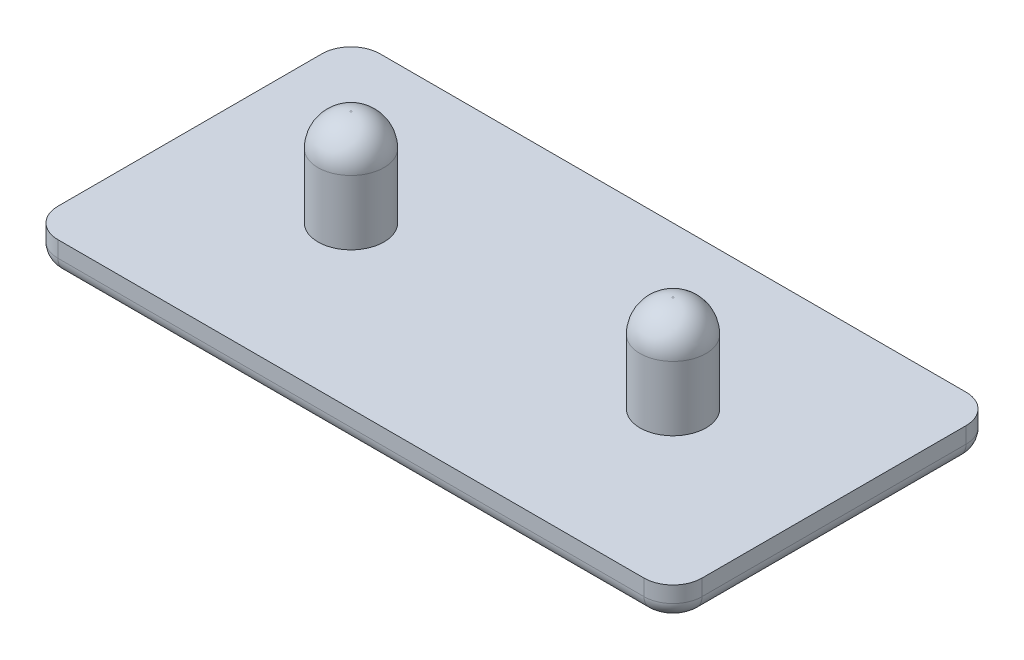
ISO-10303-21;
HEADER;
FILE_DESCRIPTION(('STEP AP214'),'2;1');
FILE_NAME('part.step','',(''),(''),'','','');
FILE_SCHEMA(('AUTOMOTIVE_DESIGN { 1 0 10303 214 1 1 1 1 }'));
ENDSEC;
DATA;
#1=APPLICATION_CONTEXT('core data for automotive mechanical design processes');
#2=APPLICATION_PROTOCOL_DEFINITION('international standard','automotive_design',2000,#1);
#3=PRODUCT_CONTEXT('',#1,'mechanical');
#4=PRODUCT('Part','Part','',(#3));
#5=PRODUCT_RELATED_PRODUCT_CATEGORY('part','',(#4));
#6=PRODUCT_DEFINITION_FORMATION('','',#4);
#7=PRODUCT_DEFINITION_CONTEXT('part definition',#1,'design');
#8=PRODUCT_DEFINITION('design','',#6,#7);
#9=PRODUCT_DEFINITION_SHAPE('','',#8);
#10=(LENGTH_UNIT() NAMED_UNIT(*) SI_UNIT(.MILLI.,.METRE.));
#11=(NAMED_UNIT(*) PLANE_ANGLE_UNIT() SI_UNIT($,.RADIAN.));
#12=(NAMED_UNIT(*) SI_UNIT($,.STERADIAN.) SOLID_ANGLE_UNIT());
#13=UNCERTAINTY_MEASURE_WITH_UNIT(LENGTH_MEASURE(1.E-05),#10,'distance_accuracy_value','');
#14=(GEOMETRIC_REPRESENTATION_CONTEXT(3) GLOBAL_UNCERTAINTY_ASSIGNED_CONTEXT((#13)) GLOBAL_UNIT_ASSIGNED_CONTEXT((#10,
#11,#12)) REPRESENTATION_CONTEXT('',''));
#15=CARTESIAN_POINT('',(0.,0.,0.));
#16=DIRECTION('',(0.,0.,1.));
#17=DIRECTION('',(1.,0.,0.));
#18=AXIS2_PLACEMENT_3D('',#15,#16,#17);
#19=CARTESIAN_POINT('',(1.8,2.,-1.8));
#20=DIRECTION('',(0.,1.,0.));
#21=DIRECTION('',(0.,0.,1.));
#22=AXIS2_PLACEMENT_3D('',#19,#20,#21);
#23=PLANE('',#22);
#24=CARTESIAN_POINT('',(10.,2.,-10.));
#25=DIRECTION('',(0.,1.,0.));
#26=DIRECTION('',(0.,0.,1.));
#27=AXIS2_PLACEMENT_3D('',#24,#25,#26);
#28=CIRCLE('',#27,2.05);
#29=CARTESIAN_POINT('',(10.,2.,-7.95));
#30=VERTEX_POINT('',#29);
#31=EDGE_CURVE('E153',#30,#30,#28,.T.);
#32=ORIENTED_EDGE('',*,*,#31,.F.);
#33=EDGE_LOOP('',(#32));
#34=FACE_BOUND('',#33,.T.);
#35=CARTESIAN_POINT('',(1.8,2.,-1.8));
#36=DIRECTION('',(0.,1.,0.));
#37=DIRECTION('',(0.,0.,1.));
#38=AXIS2_PLACEMENT_3D('',#35,#36,#37);
#39=CIRCLE('',#38,1.8);
#40=CARTESIAN_POINT('',(0.,2.,-1.8));
#41=VERTEX_POINT('',#40);
#42=CARTESIAN_POINT('',(1.8,2.,0.));
#43=VERTEX_POINT('',#42);
#44=EDGE_CURVE('E145',#41,#43,#39,.T.);
#45=ORIENTED_EDGE('',*,*,#44,.T.);
#46=DIRECTION('',(1.,0.,0.));
#47=VECTOR('',#46,1.);
#48=CARTESIAN_POINT('',(1.8,2.,0.));
#49=LINE('',#48,#47);
#50=CARTESIAN_POINT('',(38.2,2.,0.));
#51=VERTEX_POINT('',#50);
#52=EDGE_CURVE('E132',#43,#51,#49,.T.);
#53=ORIENTED_EDGE('',*,*,#52,.T.);
#54=CARTESIAN_POINT('',(38.2,2.,-1.8));
#55=DIRECTION('',(0.,1.,0.));
#56=DIRECTION('',(0.,0.,1.));
#57=AXIS2_PLACEMENT_3D('',#54,#55,#56);
#58=CIRCLE('',#57,1.8);
#59=CARTESIAN_POINT('',(40.,2.,-1.8));
#60=VERTEX_POINT('',#59);
#61=EDGE_CURVE('E144',#51,#60,#58,.T.);
#62=ORIENTED_EDGE('',*,*,#61,.T.);
#63=DIRECTION('',(0.,0.,-1.));
#64=VECTOR('',#63,1.);
#65=CARTESIAN_POINT('',(40.,2.,-1.8));
#66=LINE('',#65,#64);
#67=CARTESIAN_POINT('',(40.,2.,-18.2));
#68=VERTEX_POINT('',#67);
#69=EDGE_CURVE('E269',#60,#68,#66,.T.);
#70=ORIENTED_EDGE('',*,*,#69,.T.);
#71=CARTESIAN_POINT('',(38.2,2.,-18.2));
#72=DIRECTION('',(0.,1.,0.));
#73=DIRECTION('',(0.,0.,1.));
#74=AXIS2_PLACEMENT_3D('',#71,#72,#73);
#75=CIRCLE('',#74,1.8);
#76=CARTESIAN_POINT('',(38.2,2.,-20.));
#77=VERTEX_POINT('',#76);
#78=EDGE_CURVE('E272',#68,#77,#75,.T.);
#79=ORIENTED_EDGE('',*,*,#78,.T.);
#80=DIRECTION('',(-1.,0.,0.));
#81=VECTOR('',#80,1.);
#82=CARTESIAN_POINT('',(1.8,2.,-20.));
#83=LINE('',#82,#81);
#84=CARTESIAN_POINT('',(1.8,2.,-20.));
#85=VERTEX_POINT('',#84);
#86=EDGE_CURVE('E275',#77,#85,#83,.T.);
#87=ORIENTED_EDGE('',*,*,#86,.T.);
#88=CARTESIAN_POINT('',(1.8,2.,-18.2));
#89=DIRECTION('',(0.,1.,0.));
#90=DIRECTION('',(0.,0.,1.));
#91=AXIS2_PLACEMENT_3D('',#88,#89,#90);
#92=CIRCLE('',#91,1.8);
#93=CARTESIAN_POINT('',(0.,2.,-18.2));
#94=VERTEX_POINT('',#93);
#95=EDGE_CURVE('E278',#85,#94,#92,.T.);
#96=ORIENTED_EDGE('',*,*,#95,.T.);
#97=DIRECTION('',(0.,0.,1.));
#98=VECTOR('',#97,1.);
#99=CARTESIAN_POINT('',(0.,2.,-1.8));
#100=LINE('',#99,#98);
#101=EDGE_CURVE('E150',#94,#41,#100,.T.);
#102=ORIENTED_EDGE('',*,*,#101,.T.);
#103=EDGE_LOOP('',(#45,#53,#62,#70,#79,#87,#96,#102));
#104=FACE_BOUND('',#103,.T.);
#105=CARTESIAN_POINT('',(30.,2.,-10.));
#106=DIRECTION('',(0.,1.,0.));
#107=DIRECTION('',(0.,0.,1.));
#108=AXIS2_PLACEMENT_3D('',#105,#106,#107);
#109=CIRCLE('',#108,2.04999999999999);
#110=CARTESIAN_POINT('',(30.,2.,-7.95000000000001));
#111=VERTEX_POINT('',#110);
#112=EDGE_CURVE('E254',#111,#111,#109,.T.);
#113=ORIENTED_EDGE('',*,*,#112,.F.);
#114=EDGE_LOOP('',(#113));
#115=FACE_BOUND('',#114,.T.);
#116=ADVANCED_FACE('F39',(#34,#104,#115),#23,.T.);
#117=CARTESIAN_POINT('',(1.8,0.,-1.8));
#118=DIRECTION('',(0.,1.,0.));
#119=DIRECTION('',(0.,0.,1.));
#120=AXIS2_PLACEMENT_3D('',#117,#118,#119);
#121=PLANE('',#120);
#122=CARTESIAN_POINT('',(38.2,0.,-1.8));
#123=DIRECTION('',(0.,1.,0.));
#124=DIRECTION('',(0.,0.,1.));
#125=AXIS2_PLACEMENT_3D('',#122,#123,#124);
#126=CIRCLE('',#125,0.800000000000001);
#127=CARTESIAN_POINT('',(39.,0.,-1.8));
#128=VERTEX_POINT('',#127);
#129=CARTESIAN_POINT('',(38.2,0.,-0.999999999999999));
#130=VERTEX_POINT('',#129);
#131=EDGE_CURVE('E201',#128,#130,#126,.F.);
#132=ORIENTED_EDGE('',*,*,#131,.T.);
#133=DIRECTION('',(1.,0.,0.));
#134=VECTOR('',#133,1.);
#135=CARTESIAN_POINT('',(1.8,0.,-1.));
#136=LINE('',#135,#134);
#137=CARTESIAN_POINT('',(1.8,0.,-1.));
#138=VERTEX_POINT('',#137);
#139=EDGE_CURVE('E204',#130,#138,#136,.F.);
#140=ORIENTED_EDGE('',*,*,#139,.T.);
#141=CARTESIAN_POINT('',(1.8,0.,-1.8));
#142=DIRECTION('',(0.,1.,0.));
#143=DIRECTION('',(0.,0.,1.));
#144=AXIS2_PLACEMENT_3D('',#141,#142,#143);
#145=CIRCLE('',#144,0.8);
#146=CARTESIAN_POINT('',(1.,0.,-1.8));
#147=VERTEX_POINT('',#146);
#148=EDGE_CURVE('E183',#138,#147,#145,.F.);
#149=ORIENTED_EDGE('',*,*,#148,.T.);
#150=DIRECTION('',(0.,0.,1.));
#151=VECTOR('',#150,1.);
#152=CARTESIAN_POINT('',(1.,0.,-1.8));
#153=LINE('',#152,#151);
#154=CARTESIAN_POINT('',(1.,0.,-18.2));
#155=VERTEX_POINT('',#154);
#156=EDGE_CURVE('E186',#147,#155,#153,.F.);
#157=ORIENTED_EDGE('',*,*,#156,.T.);
#158=CARTESIAN_POINT('',(1.8,0.,-18.2));
#159=DIRECTION('',(0.,1.,0.));
#160=DIRECTION('',(0.,0.,1.));
#161=AXIS2_PLACEMENT_3D('',#158,#159,#160);
#162=CIRCLE('',#161,0.8);
#163=CARTESIAN_POINT('',(1.8,0.,-19.));
#164=VERTEX_POINT('',#163);
#165=EDGE_CURVE('E189',#155,#164,#162,.F.);
#166=ORIENTED_EDGE('',*,*,#165,.T.);
#167=DIRECTION('',(-1.,0.,0.));
#168=VECTOR('',#167,1.);
#169=CARTESIAN_POINT('',(1.8,0.,-19.));
#170=LINE('',#169,#168);
#171=CARTESIAN_POINT('',(38.2,0.,-19.));
#172=VERTEX_POINT('',#171);
#173=EDGE_CURVE('E192',#164,#172,#170,.F.);
#174=ORIENTED_EDGE('',*,*,#173,.T.);
#175=CARTESIAN_POINT('',(38.2,0.,-18.2));
#176=DIRECTION('',(0.,1.,0.));
#177=DIRECTION('',(0.,0.,1.));
#178=AXIS2_PLACEMENT_3D('',#175,#176,#177);
#179=CIRCLE('',#178,0.800000000000001);
#180=CARTESIAN_POINT('',(39.,0.,-18.2));
#181=VERTEX_POINT('',#180);
#182=EDGE_CURVE('E195',#172,#181,#179,.F.);
#183=ORIENTED_EDGE('',*,*,#182,.T.);
#184=DIRECTION('',(0.,0.,-1.));
#185=VECTOR('',#184,1.);
#186=CARTESIAN_POINT('',(39.,0.,-1.8));
#187=LINE('',#186,#185);
#188=EDGE_CURVE('E198',#181,#128,#187,.F.);
#189=ORIENTED_EDGE('',*,*,#188,.T.);
#190=EDGE_LOOP('',(#132,#140,#149,#157,#166,#174,#183,#189));
#191=FACE_BOUND('',#190,.T.);
#192=ADVANCED_FACE('F320',(#191),#121,.F.);
#193=CARTESIAN_POINT('',(1.8,2.,-1.8));
#194=DIRECTION('',(0.,-1.,0.));
#195=DIRECTION('',(0.,0.,-1.));
#196=AXIS2_PLACEMENT_3D('',#193,#194,#195);
#197=CYLINDRICAL_SURFACE('',#196,1.8);
#198=DIRECTION('',(0.,-1.,0.));
#199=VECTOR('',#198,1.);
#200=CARTESIAN_POINT('',(0.,2.,-1.8));
#201=LINE('',#200,#199);
#202=CARTESIAN_POINT('',(0.,1.,-1.8));
#203=VERTEX_POINT('',#202);
#204=EDGE_CURVE('E283',#41,#203,#201,.T.);
#205=ORIENTED_EDGE('',*,*,#204,.T.);
#206=CARTESIAN_POINT('',(1.8,1.,-1.8));
#207=DIRECTION('',(0.,1.,0.));
#208=DIRECTION('',(0.,0.,1.));
#209=AXIS2_PLACEMENT_3D('',#206,#207,#208);
#210=CIRCLE('',#209,1.8);
#211=CARTESIAN_POINT('',(1.8,1.,0.));
#212=VERTEX_POINT('',#211);
#213=EDGE_CURVE('E11',#203,#212,#210,.T.);
#214=ORIENTED_EDGE('',*,*,#213,.T.);
#215=DIRECTION('',(0.,-1.,0.));
#216=VECTOR('',#215,1.);
#217=CARTESIAN_POINT('',(1.8,2.,0.));
#218=LINE('',#217,#216);
#219=EDGE_CURVE('E137',#43,#212,#218,.T.);
#220=ORIENTED_EDGE('',*,*,#219,.F.);
#221=ORIENTED_EDGE('',*,*,#44,.F.);
#222=EDGE_LOOP('',(#205,#214,#220,#221));
#223=FACE_BOUND('',#222,.T.);
#224=ADVANCED_FACE('F155',(#223),#197,.T.);
#225=CARTESIAN_POINT('',(1.8,2.,0.));
#226=DIRECTION('',(0.,0.,-1.));
#227=DIRECTION('',(-1.,0.,0.));
#228=AXIS2_PLACEMENT_3D('',#225,#226,#227);
#229=PLANE('',#228);
#230=ORIENTED_EDGE('',*,*,#219,.T.);
#231=DIRECTION('',(1.,0.,0.));
#232=VECTOR('',#231,1.);
#233=CARTESIAN_POINT('',(1.8,1.,0.));
#234=LINE('',#233,#232);
#235=CARTESIAN_POINT('',(38.2,1.,0.));
#236=VERTEX_POINT('',#235);
#237=EDGE_CURVE('E180',#212,#236,#234,.T.);
#238=ORIENTED_EDGE('',*,*,#237,.T.);
#239=DIRECTION('',(0.,-1.,0.));
#240=VECTOR('',#239,1.);
#241=CARTESIAN_POINT('',(38.2,2.,0.));
#242=LINE('',#241,#240);
#243=EDGE_CURVE('E140',#51,#236,#242,.T.);
#244=ORIENTED_EDGE('',*,*,#243,.F.);
#245=ORIENTED_EDGE('',*,*,#52,.F.);
#246=EDGE_LOOP('',(#230,#238,#244,#245));
#247=FACE_BOUND('',#246,.T.);
#248=ADVANCED_FACE('F134',(#247),#229,.F.);
#249=CARTESIAN_POINT('',(38.2,2.,-1.8));
#250=DIRECTION('',(0.,-1.,0.));
#251=DIRECTION('',(0.,0.,-1.));
#252=AXIS2_PLACEMENT_3D('',#249,#250,#251);
#253=CYLINDRICAL_SURFACE('',#252,1.8);
#254=ORIENTED_EDGE('',*,*,#243,.T.);
#255=CARTESIAN_POINT('',(38.2,1.,-1.8));
#256=DIRECTION('',(0.,1.,0.));
#257=DIRECTION('',(0.,0.,1.));
#258=AXIS2_PLACEMENT_3D('',#255,#256,#257);
#259=CIRCLE('',#258,1.8);
#260=CARTESIAN_POINT('',(40.,1.,-1.8));
#261=VERTEX_POINT('',#260);
#262=EDGE_CURVE('E208',#236,#261,#259,.T.);
#263=ORIENTED_EDGE('',*,*,#262,.T.);
#264=DIRECTION('',(0.,-1.,0.));
#265=VECTOR('',#264,1.);
#266=CARTESIAN_POINT('',(40.,2.,-1.8));
#267=LINE('',#266,#265);
#268=EDGE_CURVE('E165',#60,#261,#267,.T.);
#269=ORIENTED_EDGE('',*,*,#268,.F.);
#270=ORIENTED_EDGE('',*,*,#61,.F.);
#271=EDGE_LOOP('',(#254,#263,#269,#270));
#272=FACE_BOUND('',#271,.T.);
#273=ADVANCED_FACE('F346',(#272),#253,.T.);
#274=CARTESIAN_POINT('',(40.,2.,-1.8));
#275=DIRECTION('',(-1.,0.,0.));
#276=DIRECTION('',(0.,0.,1.));
#277=AXIS2_PLACEMENT_3D('',#274,#275,#276);
#278=PLANE('',#277);
#279=ORIENTED_EDGE('',*,*,#268,.T.);
#280=DIRECTION('',(0.,0.,-1.));
#281=VECTOR('',#280,1.);
#282=CARTESIAN_POINT('',(40.,1.,-1.8));
#283=LINE('',#282,#281);
#284=CARTESIAN_POINT('',(40.,1.,-18.2));
#285=VERTEX_POINT('',#284);
#286=EDGE_CURVE('E211',#261,#285,#283,.T.);
#287=ORIENTED_EDGE('',*,*,#286,.T.);
#288=DIRECTION('',(0.,-1.,0.));
#289=VECTOR('',#288,1.);
#290=CARTESIAN_POINT('',(40.,2.,-18.2));
#291=LINE('',#290,#289);
#292=EDGE_CURVE('E296',#68,#285,#291,.T.);
#293=ORIENTED_EDGE('',*,*,#292,.F.);
#294=ORIENTED_EDGE('',*,*,#69,.F.);
#295=EDGE_LOOP('',(#279,#287,#293,#294));
#296=FACE_BOUND('',#295,.T.);
#297=ADVANCED_FACE('F305',(#296),#278,.F.);
#298=CARTESIAN_POINT('',(38.2,2.,-18.2));
#299=DIRECTION('',(0.,-1.,0.));
#300=DIRECTION('',(0.,0.,-1.));
#301=AXIS2_PLACEMENT_3D('',#298,#299,#300);
#302=CYLINDRICAL_SURFACE('',#301,1.8);
#303=ORIENTED_EDGE('',*,*,#292,.T.);
#304=CARTESIAN_POINT('',(38.2,1.,-18.2));
#305=DIRECTION('',(0.,1.,0.));
#306=DIRECTION('',(0.,0.,1.));
#307=AXIS2_PLACEMENT_3D('',#304,#305,#306);
#308=CIRCLE('',#307,1.8);
#309=CARTESIAN_POINT('',(38.2,1.,-20.));
#310=VERTEX_POINT('',#309);
#311=EDGE_CURVE('E214',#285,#310,#308,.T.);
#312=ORIENTED_EDGE('',*,*,#311,.T.);
#313=DIRECTION('',(0.,-1.,0.));
#314=VECTOR('',#313,1.);
#315=CARTESIAN_POINT('',(38.2,2.,-20.));
#316=LINE('',#315,#314);
#317=EDGE_CURVE('E292',#77,#310,#316,.T.);
#318=ORIENTED_EDGE('',*,*,#317,.F.);
#319=ORIENTED_EDGE('',*,*,#78,.F.);
#320=EDGE_LOOP('',(#303,#312,#318,#319));
#321=FACE_BOUND('',#320,.T.);
#322=ADVANCED_FACE('F339',(#321),#302,.T.);
#323=CARTESIAN_POINT('',(1.8,2.,-20.));
#324=DIRECTION('',(0.,0.,1.));
#325=DIRECTION('',(1.,0.,0.));
#326=AXIS2_PLACEMENT_3D('',#323,#324,#325);
#327=PLANE('',#326);
#328=ORIENTED_EDGE('',*,*,#317,.T.);
#329=DIRECTION('',(-1.,0.,0.));
#330=VECTOR('',#329,1.);
#331=CARTESIAN_POINT('',(1.8,1.,-20.));
#332=LINE('',#331,#330);
#333=CARTESIAN_POINT('',(1.8,1.,-20.));
#334=VERTEX_POINT('',#333);
#335=EDGE_CURVE('E217',#310,#334,#332,.T.);
#336=ORIENTED_EDGE('',*,*,#335,.T.);
#337=DIRECTION('',(0.,-1.,0.));
#338=VECTOR('',#337,1.);
#339=CARTESIAN_POINT('',(1.8,2.,-20.));
#340=LINE('',#339,#338);
#341=EDGE_CURVE('E289',#85,#334,#340,.T.);
#342=ORIENTED_EDGE('',*,*,#341,.F.);
#343=ORIENTED_EDGE('',*,*,#86,.F.);
#344=EDGE_LOOP('',(#328,#336,#342,#343));
#345=FACE_BOUND('',#344,.T.);
#346=ADVANCED_FACE('F343',(#345),#327,.F.);
#347=CARTESIAN_POINT('',(1.8,2.,-18.2));
#348=DIRECTION('',(0.,-1.,0.));
#349=DIRECTION('',(0.,0.,-1.));
#350=AXIS2_PLACEMENT_3D('',#347,#348,#349);
#351=CYLINDRICAL_SURFACE('',#350,1.8);
#352=ORIENTED_EDGE('',*,*,#341,.T.);
#353=CARTESIAN_POINT('',(1.8,1.,-18.2));
#354=DIRECTION('',(0.,1.,0.));
#355=DIRECTION('',(0.,0.,1.));
#356=AXIS2_PLACEMENT_3D('',#353,#354,#355);
#357=CIRCLE('',#356,1.8);
#358=CARTESIAN_POINT('',(0.,1.,-18.2));
#359=VERTEX_POINT('',#358);
#360=EDGE_CURVE('E64',#334,#359,#357,.T.);
#361=ORIENTED_EDGE('',*,*,#360,.T.);
#362=DIRECTION('',(0.,-1.,0.));
#363=VECTOR('',#362,1.);
#364=CARTESIAN_POINT('',(0.,2.,-18.2));
#365=LINE('',#364,#363);
#366=EDGE_CURVE('E286',#94,#359,#365,.T.);
#367=ORIENTED_EDGE('',*,*,#366,.F.);
#368=ORIENTED_EDGE('',*,*,#95,.F.);
#369=EDGE_LOOP('',(#352,#361,#367,#368));
#370=FACE_BOUND('',#369,.T.);
#371=ADVANCED_FACE('F370',(#370),#351,.T.);
#372=CARTESIAN_POINT('',(0.,2.,-1.8));
#373=DIRECTION('',(1.,0.,0.));
#374=DIRECTION('',(0.,0.,-1.));
#375=AXIS2_PLACEMENT_3D('',#372,#373,#374);
#376=PLANE('',#375);
#377=ORIENTED_EDGE('',*,*,#366,.T.);
#378=DIRECTION('',(0.,0.,1.));
#379=VECTOR('',#378,1.);
#380=CARTESIAN_POINT('',(0.,1.,-1.8));
#381=LINE('',#380,#379);
#382=EDGE_CURVE('E49',#359,#203,#381,.T.);
#383=ORIENTED_EDGE('',*,*,#382,.T.);
#384=ORIENTED_EDGE('',*,*,#204,.F.);
#385=ORIENTED_EDGE('',*,*,#101,.F.);
#386=EDGE_LOOP('',(#377,#383,#384,#385));
#387=FACE_BOUND('',#386,.T.);
#388=ADVANCED_FACE('F367',(#387),#376,.F.);
#389=CARTESIAN_POINT('',(30.,8.,-10.));
#390=DIRECTION('',(0.,-1.,0.));
#391=DIRECTION('',(0.,0.,-1.));
#392=AXIS2_PLACEMENT_3D('',#389,#390,#391);
#393=CYLINDRICAL_SURFACE('',#392,2.04999999999999);
#394=CARTESIAN_POINT('',(30.,6.,-10.));
#395=DIRECTION('',(0.,1.,0.));
#396=DIRECTION('',(0.,0.,1.));
#397=AXIS2_PLACEMENT_3D('',#394,#395,#396);
#398=CIRCLE('',#397,2.04999999999999);
#399=CARTESIAN_POINT('',(30.,6.,-7.95000000000001));
#400=VERTEX_POINT('',#399);
#401=EDGE_CURVE('E176',#400,#400,#398,.F.);
#402=ORIENTED_EDGE('',*,*,#401,.T.);
#403=EDGE_LOOP('',(#402));
#404=FACE_BOUND('',#403,.T.);
#405=ORIENTED_EDGE('',*,*,#112,.T.);
#406=EDGE_LOOP('',(#405));
#407=FACE_BOUND('',#406,.T.);
#408=ADVANCED_FACE('F364',(#404,#407),#393,.T.);
#409=CARTESIAN_POINT('',(0.,8.,0.));
#410=DIRECTION('',(0.,1.,0.));
#411=DIRECTION('',(0.,0.,1.));
#412=AXIS2_PLACEMENT_3D('',#409,#410,#411);
#413=PLANE('',#412);
#414=CARTESIAN_POINT('',(30.,8.,-10.));
#415=DIRECTION('',(0.,1.,0.));
#416=DIRECTION('',(0.,0.,1.));
#417=AXIS2_PLACEMENT_3D('',#414,#415,#416);
#418=CIRCLE('',#417,0.0499999999999932);
#419=CARTESIAN_POINT('',(30.,8.,-9.95000000000001));
#420=VERTEX_POINT('',#419);
#421=EDGE_CURVE('E172',#420,#420,#418,.T.);
#422=ORIENTED_EDGE('',*,*,#421,.T.);
#423=EDGE_LOOP('',(#422));
#424=FACE_BOUND('',#423,.T.);
#425=ADVANCED_FACE('F399',(#424),#413,.T.);
#426=CARTESIAN_POINT('',(10.,8.,-10.));
#427=DIRECTION('',(0.,-1.,0.));
#428=DIRECTION('',(0.,0.,-1.));
#429=AXIS2_PLACEMENT_3D('',#426,#427,#428);
#430=CYLINDRICAL_SURFACE('',#429,2.05);
#431=CARTESIAN_POINT('',(10.,6.,-10.));
#432=DIRECTION('',(0.,1.,0.));
#433=DIRECTION('',(0.,0.,1.));
#434=AXIS2_PLACEMENT_3D('',#431,#432,#433);
#435=CIRCLE('',#434,2.05);
#436=CARTESIAN_POINT('',(10.,6.,-7.95));
#437=VERTEX_POINT('',#436);
#438=EDGE_CURVE('E163',#437,#437,#435,.F.);
#439=ORIENTED_EDGE('',*,*,#438,.T.);
#440=EDGE_LOOP('',(#439));
#441=FACE_BOUND('',#440,.T.);
#442=ORIENTED_EDGE('',*,*,#31,.T.);
#443=EDGE_LOOP('',(#442));
#444=FACE_BOUND('',#443,.T.);
#445=ADVANCED_FACE('F406',(#441,#444),#430,.T.);
#446=CARTESIAN_POINT('',(0.,8.,0.));
#447=DIRECTION('',(0.,1.,0.));
#448=DIRECTION('',(0.,0.,1.));
#449=AXIS2_PLACEMENT_3D('',#446,#447,#448);
#450=PLANE('',#449);
#451=CARTESIAN_POINT('',(10.,8.,-10.));
#452=DIRECTION('',(0.,1.,0.));
#453=DIRECTION('',(0.,0.,1.));
#454=AXIS2_PLACEMENT_3D('',#451,#452,#453);
#455=CIRCLE('',#454,0.0500000000000001);
#456=CARTESIAN_POINT('',(10.,8.,-9.95));
#457=VERTEX_POINT('',#456);
#458=EDGE_CURVE('E158',#457,#457,#455,.T.);
#459=ORIENTED_EDGE('',*,*,#458,.T.);
#460=EDGE_LOOP('',(#459));
#461=FACE_BOUND('',#460,.T.);
#462=ADVANCED_FACE('F413',(#461),#450,.T.);
#463=CARTESIAN_POINT('',(10.,6.,-10.));
#464=DIRECTION('',(0.,1.,0.));
#465=DIRECTION('',(0.,0.,1.));
#466=AXIS2_PLACEMENT_3D('',#463,#464,#465);
#467=DEGENERATE_TOROIDAL_SURFACE('',#466,0.0500000000000001,2.,.T.);
#468=ORIENTED_EDGE('',*,*,#438,.F.);
#469=EDGE_LOOP('',(#468));
#470=FACE_BOUND('',#469,.T.);
#471=ORIENTED_EDGE('',*,*,#458,.F.);
#472=EDGE_LOOP('',(#471));
#473=FACE_BOUND('',#472,.T.);
#474=ADVANCED_FACE('F421',(#470,#473),#467,.T.);
#475=CARTESIAN_POINT('',(30.,6.,-10.));
#476=DIRECTION('',(0.,1.,0.));
#477=DIRECTION('',(0.,0.,1.));
#478=AXIS2_PLACEMENT_3D('',#475,#476,#477);
#479=DEGENERATE_TOROIDAL_SURFACE('',#478,0.0499999999999932,2.,.T.);
#480=ORIENTED_EDGE('',*,*,#401,.F.);
#481=EDGE_LOOP('',(#480));
#482=FACE_BOUND('',#481,.T.);
#483=ORIENTED_EDGE('',*,*,#421,.F.);
#484=EDGE_LOOP('',(#483));
#485=FACE_BOUND('',#484,.T.);
#486=ADVANCED_FACE('F429',(#482,#485),#479,.T.);
#487=CARTESIAN_POINT('',(1.8,1.,-19.));
#488=DIRECTION('',(-1.,0.,0.));
#489=DIRECTION('',(0.,0.,1.));
#490=AXIS2_PLACEMENT_3D('',#487,#488,#489);
#491=CYLINDRICAL_SURFACE('',#490,1.);
#492=CARTESIAN_POINT('',(38.2,1.,-19.));
#493=DIRECTION('',(1.,0.,0.));
#494=DIRECTION('',(0.,0.,-1.));
#495=AXIS2_PLACEMENT_3D('',#492,#493,#494);
#496=CIRCLE('',#495,1.);
#497=EDGE_CURVE('E245',#172,#310,#496,.T.);
#498=ORIENTED_EDGE('',*,*,#497,.F.);
#499=ORIENTED_EDGE('',*,*,#173,.F.);
#500=CARTESIAN_POINT('',(1.8,1.,-19.));
#501=DIRECTION('',(-1.,0.,0.));
#502=DIRECTION('',(0.,0.,1.));
#503=AXIS2_PLACEMENT_3D('',#500,#501,#502);
#504=CIRCLE('',#503,1.);
#505=EDGE_CURVE('E43',#334,#164,#504,.T.);
#506=ORIENTED_EDGE('',*,*,#505,.F.);
#507=ORIENTED_EDGE('',*,*,#335,.F.);
#508=EDGE_LOOP('',(#498,#499,#506,#507));
#509=FACE_BOUND('',#508,.T.);
#510=ADVANCED_FACE('F41',(#509),#491,.T.);
#511=CARTESIAN_POINT('',(1.8,1.,-18.2));
#512=DIRECTION('',(0.,1.,0.));
#513=DIRECTION('',(0.,0.,1.));
#514=AXIS2_PLACEMENT_3D('',#511,#512,#513);
#515=DEGENERATE_TOROIDAL_SURFACE('',#514,0.8,1.,.T.);
#516=ORIENTED_EDGE('',*,*,#505,.T.);
#517=ORIENTED_EDGE('',*,*,#165,.F.);
#518=CARTESIAN_POINT('',(1.,1.,-18.2));
#519=DIRECTION('',(0.,0.,1.));
#520=DIRECTION('',(1.,0.,0.));
#521=AXIS2_PLACEMENT_3D('',#518,#519,#520);
#522=CIRCLE('',#521,1.);
#523=EDGE_CURVE('E242',#359,#155,#522,.T.);
#524=ORIENTED_EDGE('',*,*,#523,.F.);
#525=ORIENTED_EDGE('',*,*,#360,.F.);
#526=EDGE_LOOP('',(#516,#517,#524,#525));
#527=FACE_BOUND('',#526,.T.);
#528=ADVANCED_FACE('F332',(#527),#515,.T.);
#529=CARTESIAN_POINT('',(38.2,1.,-18.2));
#530=DIRECTION('',(0.,1.,0.));
#531=DIRECTION('',(0.,0.,1.));
#532=AXIS2_PLACEMENT_3D('',#529,#530,#531);
#533=DEGENERATE_TOROIDAL_SURFACE('',#532,0.800000000000001,1.,.T.);
#534=ORIENTED_EDGE('',*,*,#497,.T.);
#535=ORIENTED_EDGE('',*,*,#311,.F.);
#536=CARTESIAN_POINT('',(39.,1.,-18.2));
#537=DIRECTION('',(0.,0.,1.));
#538=DIRECTION('',(1.,0.,0.));
#539=AXIS2_PLACEMENT_3D('',#536,#537,#538);
#540=CIRCLE('',#539,1.);
#541=EDGE_CURVE('E238',#181,#285,#540,.T.);
#542=ORIENTED_EDGE('',*,*,#541,.F.);
#543=ORIENTED_EDGE('',*,*,#182,.F.);
#544=EDGE_LOOP('',(#534,#535,#542,#543));
#545=FACE_BOUND('',#544,.T.);
#546=ADVANCED_FACE('F336',(#545),#533,.T.);
#547=CARTESIAN_POINT('',(1.,1.,-1.8));
#548=DIRECTION('',(0.,0.,1.));
#549=DIRECTION('',(1.,0.,0.));
#550=AXIS2_PLACEMENT_3D('',#547,#548,#549);
#551=CYLINDRICAL_SURFACE('',#550,1.);
#552=ORIENTED_EDGE('',*,*,#523,.T.);
#553=ORIENTED_EDGE('',*,*,#156,.F.);
#554=CARTESIAN_POINT('',(1.,1.,-1.8));
#555=DIRECTION('',(0.,0.,1.));
#556=DIRECTION('',(1.,0.,0.));
#557=AXIS2_PLACEMENT_3D('',#554,#555,#556);
#558=CIRCLE('',#557,1.);
#559=EDGE_CURVE('E234',#203,#147,#558,.T.);
#560=ORIENTED_EDGE('',*,*,#559,.F.);
#561=ORIENTED_EDGE('',*,*,#382,.F.);
#562=EDGE_LOOP('',(#552,#553,#560,#561));
#563=FACE_BOUND('',#562,.T.);
#564=ADVANCED_FACE('F330',(#563),#551,.T.);
#565=CARTESIAN_POINT('',(39.,1.,-1.8));
#566=DIRECTION('',(0.,0.,-1.));
#567=DIRECTION('',(-1.,0.,0.));
#568=AXIS2_PLACEMENT_3D('',#565,#566,#567);
#569=CYLINDRICAL_SURFACE('',#568,1.);
#570=ORIENTED_EDGE('',*,*,#541,.T.);
#571=ORIENTED_EDGE('',*,*,#286,.F.);
#572=CARTESIAN_POINT('',(39.,1.,-1.8));
#573=DIRECTION('',(0.,0.,1.));
#574=DIRECTION('',(1.,0.,0.));
#575=AXIS2_PLACEMENT_3D('',#572,#573,#574);
#576=CIRCLE('',#575,1.);
#577=EDGE_CURVE('E230',#128,#261,#576,.T.);
#578=ORIENTED_EDGE('',*,*,#577,.F.);
#579=ORIENTED_EDGE('',*,*,#188,.F.);
#580=EDGE_LOOP('',(#570,#571,#578,#579));
#581=FACE_BOUND('',#580,.T.);
#582=ADVANCED_FACE('F310',(#581),#569,.T.);
#583=CARTESIAN_POINT('',(1.8,1.,-1.8));
#584=DIRECTION('',(0.,1.,0.));
#585=DIRECTION('',(0.,0.,1.));
#586=AXIS2_PLACEMENT_3D('',#583,#584,#585);
#587=DEGENERATE_TOROIDAL_SURFACE('',#586,0.8,1.,.T.);
#588=ORIENTED_EDGE('',*,*,#559,.T.);
#589=ORIENTED_EDGE('',*,*,#148,.F.);
#590=CARTESIAN_POINT('',(1.8,1.,-1.));
#591=DIRECTION('',(1.,0.,0.));
#592=DIRECTION('',(0.,0.,-1.));
#593=AXIS2_PLACEMENT_3D('',#590,#591,#592);
#594=CIRCLE('',#593,1.);
#595=EDGE_CURVE('E227',#212,#138,#594,.T.);
#596=ORIENTED_EDGE('',*,*,#595,.F.);
#597=ORIENTED_EDGE('',*,*,#213,.F.);
#598=EDGE_LOOP('',(#588,#589,#596,#597));
#599=FACE_BOUND('',#598,.T.);
#600=ADVANCED_FACE('F326',(#599),#587,.T.);
#601=CARTESIAN_POINT('',(38.2,1.,-1.8));
#602=DIRECTION('',(0.,1.,0.));
#603=DIRECTION('',(0.,0.,1.));
#604=AXIS2_PLACEMENT_3D('',#601,#602,#603);
#605=DEGENERATE_TOROIDAL_SURFACE('',#604,0.800000000000001,1.,.T.);
#606=ORIENTED_EDGE('',*,*,#577,.T.);
#607=ORIENTED_EDGE('',*,*,#262,.F.);
#608=CARTESIAN_POINT('',(38.2,1.,-0.999999999999999));
#609=DIRECTION('',(-1.,0.,0.));
#610=DIRECTION('',(0.,0.,1.));
#611=AXIS2_PLACEMENT_3D('',#608,#609,#610);
#612=CIRCLE('',#611,1.);
#613=EDGE_CURVE('E224',#130,#236,#612,.T.);
#614=ORIENTED_EDGE('',*,*,#613,.F.);
#615=ORIENTED_EDGE('',*,*,#131,.F.);
#616=EDGE_LOOP('',(#606,#607,#614,#615));
#617=FACE_BOUND('',#616,.T.);
#618=ADVANCED_FACE('F316',(#617),#605,.T.);
#619=CARTESIAN_POINT('',(1.8,1.,-1.));
#620=DIRECTION('',(1.,0.,0.));
#621=DIRECTION('',(0.,0.,-1.));
#622=AXIS2_PLACEMENT_3D('',#619,#620,#621);
#623=CYLINDRICAL_SURFACE('',#622,1.);
#624=ORIENTED_EDGE('',*,*,#595,.T.);
#625=ORIENTED_EDGE('',*,*,#139,.F.);
#626=ORIENTED_EDGE('',*,*,#613,.T.);
#627=ORIENTED_EDGE('',*,*,#237,.F.);
#628=EDGE_LOOP('',(#624,#625,#626,#627));
#629=FACE_BOUND('',#628,.T.);
#630=ADVANCED_FACE('F322',(#629),#623,.T.);
#631=CLOSED_SHELL('',(#116,#192,#224,#248,#273,#297,#322,#346,#371,#388,#408,#425,#445,#462,
#474,#486,#510,#528,#546,#564,#582,#600,#618,#630));
#632=MANIFOLD_SOLID_BREP('B2',#631);
#633=ADVANCED_BREP_SHAPE_REPRESENTATION('',(#18,#632),#14);
#634=SHAPE_DEFINITION_REPRESENTATION(#9,#633);
ENDSEC;
END-ISO-10303-21;
